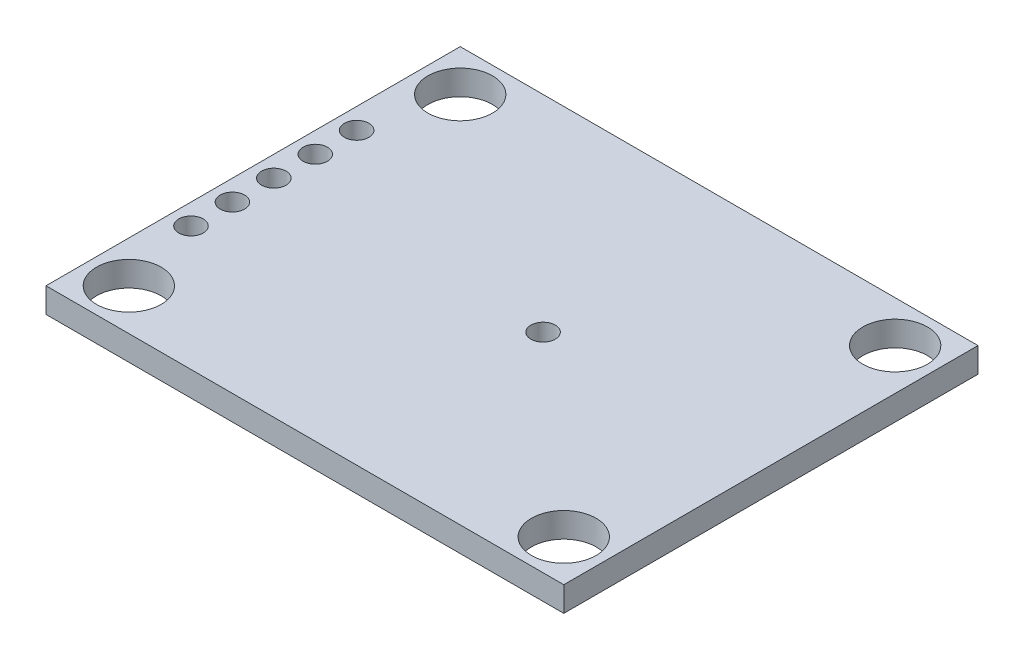
ISO-10303-21;
HEADER;
FILE_DESCRIPTION(('STEP AP214'),'2;1');
FILE_NAME('part.step','',(''),(''),'','','');
FILE_SCHEMA(('AUTOMOTIVE_DESIGN { 1 0 10303 214 1 1 1 1 }'));
ENDSEC;
DATA;
#1=APPLICATION_CONTEXT('core data for automotive mechanical design processes');
#2=APPLICATION_PROTOCOL_DEFINITION('international standard','automotive_design',2000,#1);
#3=PRODUCT_CONTEXT('',#1,'mechanical');
#4=PRODUCT('Part','Part','',(#3));
#5=PRODUCT_RELATED_PRODUCT_CATEGORY('part','',(#4));
#6=PRODUCT_DEFINITION_FORMATION('','',#4);
#7=PRODUCT_DEFINITION_CONTEXT('part definition',#1,'design');
#8=PRODUCT_DEFINITION('design','',#6,#7);
#9=PRODUCT_DEFINITION_SHAPE('','',#8);
#10=(LENGTH_UNIT() NAMED_UNIT(*) SI_UNIT(.MILLI.,.METRE.));
#11=(NAMED_UNIT(*) PLANE_ANGLE_UNIT() SI_UNIT($,.RADIAN.));
#12=(NAMED_UNIT(*) SI_UNIT($,.STERADIAN.) SOLID_ANGLE_UNIT());
#13=UNCERTAINTY_MEASURE_WITH_UNIT(LENGTH_MEASURE(1.E-05),#10,'distance_accuracy_value','');
#14=(GEOMETRIC_REPRESENTATION_CONTEXT(3) GLOBAL_UNCERTAINTY_ASSIGNED_CONTEXT((#13)) GLOBAL_UNIT_ASSIGNED_CONTEXT((#10,
#11,#12)) REPRESENTATION_CONTEXT('',''));
#15=CARTESIAN_POINT('',(0.,0.,0.));
#16=DIRECTION('',(0.,0.,1.));
#17=DIRECTION('',(1.,0.,0.));
#18=AXIS2_PLACEMENT_3D('',#15,#16,#17);
#19=CARTESIAN_POINT('',(15.875,1.524,12.7));
#20=DIRECTION('',(-1.,0.,0.));
#21=DIRECTION('',(0.,0.,1.));
#22=AXIS2_PLACEMENT_3D('',#19,#20,#21);
#23=PLANE('',#22);
#24=DIRECTION('',(0.,0.,-1.));
#25=VECTOR('',#24,1.);
#26=CARTESIAN_POINT('',(15.875,0.,12.7));
#27=LINE('',#26,#25);
#28=CARTESIAN_POINT('',(15.875,0.,12.7));
#29=VERTEX_POINT('',#28);
#30=CARTESIAN_POINT('',(15.875,0.,-12.7));
#31=VERTEX_POINT('',#30);
#32=EDGE_CURVE('E103',#29,#31,#27,.T.);
#33=ORIENTED_EDGE('',*,*,#32,.T.);
#34=DIRECTION('',(0.,-1.,0.));
#35=VECTOR('',#34,1.);
#36=CARTESIAN_POINT('',(15.875,1.524,-12.7));
#37=LINE('',#36,#35);
#38=CARTESIAN_POINT('',(15.875,1.524,-12.7));
#39=VERTEX_POINT('',#38);
#40=EDGE_CURVE('E94',#39,#31,#37,.T.);
#41=ORIENTED_EDGE('',*,*,#40,.F.);
#42=DIRECTION('',(0.,0.,-1.));
#43=VECTOR('',#42,1.);
#44=CARTESIAN_POINT('',(15.875,1.524,12.7));
#45=LINE('',#44,#43);
#46=CARTESIAN_POINT('',(15.875,1.524,12.7));
#47=VERTEX_POINT('',#46);
#48=EDGE_CURVE('E88',#47,#39,#45,.T.);
#49=ORIENTED_EDGE('',*,*,#48,.F.);
#50=DIRECTION('',(0.,-1.,0.));
#51=VECTOR('',#50,1.);
#52=CARTESIAN_POINT('',(15.875,1.524,12.7));
#53=LINE('',#52,#51);
#54=EDGE_CURVE('E99',#47,#29,#53,.T.);
#55=ORIENTED_EDGE('',*,*,#54,.T.);
#56=EDGE_LOOP('',(#33,#41,#49,#55));
#57=FACE_BOUND('',#56,.T.);
#58=ADVANCED_FACE('F34',(#57),#23,.F.);
#59=CARTESIAN_POINT('',(-15.875,1.524,-12.7));
#60=DIRECTION('',(0.,0.,1.));
#61=DIRECTION('',(1.,0.,0.));
#62=AXIS2_PLACEMENT_3D('',#59,#60,#61);
#63=PLANE('',#62);
#64=DIRECTION('',(-1.,0.,0.));
#65=VECTOR('',#64,1.);
#66=CARTESIAN_POINT('',(-15.875,0.,-12.7));
#67=LINE('',#66,#65);
#68=CARTESIAN_POINT('',(-15.875,0.,-12.7));
#69=VERTEX_POINT('',#68);
#70=EDGE_CURVE('E93',#31,#69,#67,.T.);
#71=ORIENTED_EDGE('',*,*,#70,.T.);
#72=DIRECTION('',(0.,-1.,0.));
#73=VECTOR('',#72,1.);
#74=CARTESIAN_POINT('',(-15.875,1.524,-12.7));
#75=LINE('',#74,#73);
#76=CARTESIAN_POINT('',(-15.875,1.524,-12.7));
#77=VERTEX_POINT('',#76);
#78=EDGE_CURVE('E91',#77,#69,#75,.T.);
#79=ORIENTED_EDGE('',*,*,#78,.F.);
#80=DIRECTION('',(-1.,0.,0.));
#81=VECTOR('',#80,1.);
#82=CARTESIAN_POINT('',(-15.875,1.524,-12.7));
#83=LINE('',#82,#81);
#84=EDGE_CURVE('E82',#39,#77,#83,.T.);
#85=ORIENTED_EDGE('',*,*,#84,.F.);
#86=ORIENTED_EDGE('',*,*,#40,.T.);
#87=EDGE_LOOP('',(#71,#79,#85,#86));
#88=FACE_BOUND('',#87,.T.);
#89=ADVANCED_FACE('F92',(#88),#63,.F.);
#90=CARTESIAN_POINT('',(-15.875,1.524,12.7));
#91=DIRECTION('',(1.,0.,0.));
#92=DIRECTION('',(0.,0.,-1.));
#93=AXIS2_PLACEMENT_3D('',#90,#91,#92);
#94=PLANE('',#93);
#95=DIRECTION('',(0.,0.,1.));
#96=VECTOR('',#95,1.);
#97=CARTESIAN_POINT('',(-15.875,0.,12.7));
#98=LINE('',#97,#96);
#99=CARTESIAN_POINT('',(-15.875,0.,12.7));
#100=VERTEX_POINT('',#99);
#101=EDGE_CURVE('E68',#69,#100,#98,.T.);
#102=ORIENTED_EDGE('',*,*,#101,.T.);
#103=DIRECTION('',(0.,-1.,0.));
#104=VECTOR('',#103,1.);
#105=CARTESIAN_POINT('',(-15.875,1.524,12.7));
#106=LINE('',#105,#104);
#107=CARTESIAN_POINT('',(-15.875,1.524,12.7));
#108=VERTEX_POINT('',#107);
#109=EDGE_CURVE('E95',#108,#100,#106,.T.);
#110=ORIENTED_EDGE('',*,*,#109,.F.);
#111=DIRECTION('',(0.,0.,1.));
#112=VECTOR('',#111,1.);
#113=CARTESIAN_POINT('',(-15.875,1.524,12.7));
#114=LINE('',#113,#112);
#115=EDGE_CURVE('E86',#77,#108,#114,.T.);
#116=ORIENTED_EDGE('',*,*,#115,.F.);
#117=ORIENTED_EDGE('',*,*,#78,.T.);
#118=EDGE_LOOP('',(#102,#110,#116,#117));
#119=FACE_BOUND('',#118,.T.);
#120=ADVANCED_FACE('F97',(#119),#94,.F.);
#121=CARTESIAN_POINT('',(-15.875,1.524,12.7));
#122=DIRECTION('',(0.,0.,-1.));
#123=DIRECTION('',(-1.,0.,0.));
#124=AXIS2_PLACEMENT_3D('',#121,#122,#123);
#125=PLANE('',#124);
#126=DIRECTION('',(1.,0.,0.));
#127=VECTOR('',#126,1.);
#128=CARTESIAN_POINT('',(-15.875,0.,12.7));
#129=LINE('',#128,#127);
#130=EDGE_CURVE('E74',#100,#29,#129,.T.);
#131=ORIENTED_EDGE('',*,*,#130,.T.);
#132=ORIENTED_EDGE('',*,*,#54,.F.);
#133=DIRECTION('',(1.,0.,0.));
#134=VECTOR('',#133,1.);
#135=CARTESIAN_POINT('',(-15.875,1.524,12.7));
#136=LINE('',#135,#134);
#137=EDGE_CURVE('E51',#108,#47,#136,.T.);
#138=ORIENTED_EDGE('',*,*,#137,.F.);
#139=ORIENTED_EDGE('',*,*,#109,.T.);
#140=EDGE_LOOP('',(#131,#132,#138,#139));
#141=FACE_BOUND('',#140,.T.);
#142=ADVANCED_FACE('F136',(#141),#125,.F.);
#143=CARTESIAN_POINT('',(15.875,1.524,-12.7));
#144=DIRECTION('',(0.,-1.,0.));
#145=DIRECTION('',(0.,0.,-1.));
#146=AXIS2_PLACEMENT_3D('',#143,#144,#145);
#147=PLANE('',#146);
#148=CARTESIAN_POINT('',(1.8288,1.524,-0.0762));
#149=DIRECTION('',(0.,1.,0.));
#150=DIRECTION('',(0.,0.,1.));
#151=AXIS2_PLACEMENT_3D('',#148,#149,#150);
#152=CIRCLE('',#151,0.7493);
#153=CARTESIAN_POINT('',(1.8288,1.524,0.6731));
#154=VERTEX_POINT('',#153);
#155=EDGE_CURVE('E284',#154,#154,#152,.T.);
#156=ORIENTED_EDGE('',*,*,#155,.F.);
#157=EDGE_LOOP('',(#156));
#158=FACE_BOUND('',#157,.T.);
#159=CARTESIAN_POINT('',(-14.605,1.524,-2.54));
#160=DIRECTION('',(0.,1.,0.));
#161=DIRECTION('',(0.,0.,1.));
#162=AXIS2_PLACEMENT_3D('',#159,#160,#161);
#163=CIRCLE('',#162,0.75);
#164=CARTESIAN_POINT('',(-14.605,1.524,-1.79));
#165=VERTEX_POINT('',#164);
#166=EDGE_CURVE('E278',#165,#165,#163,.T.);
#167=ORIENTED_EDGE('',*,*,#166,.F.);
#168=EDGE_LOOP('',(#167));
#169=FACE_BOUND('',#168,.T.);
#170=CARTESIAN_POINT('',(-14.605,1.524,-5.08));
#171=DIRECTION('',(0.,1.,0.));
#172=DIRECTION('',(0.,0.,1.));
#173=AXIS2_PLACEMENT_3D('',#170,#171,#172);
#174=CIRCLE('',#173,0.75);
#175=CARTESIAN_POINT('',(-14.605,1.524,-4.33));
#176=VERTEX_POINT('',#175);
#177=EDGE_CURVE('E282',#176,#176,#174,.T.);
#178=ORIENTED_EDGE('',*,*,#177,.F.);
#179=EDGE_LOOP('',(#178));
#180=FACE_BOUND('',#179,.T.);
#181=CARTESIAN_POINT('',(13.335,1.524,10.16));
#182=DIRECTION('',(0.,1.,0.));
#183=DIRECTION('',(0.,0.,1.));
#184=AXIS2_PLACEMENT_3D('',#181,#182,#183);
#185=CIRCLE('',#184,1.9812);
#186=CARTESIAN_POINT('',(13.335,1.524,12.1412));
#187=VERTEX_POINT('',#186);
#188=EDGE_CURVE('E291',#187,#187,#185,.T.);
#189=ORIENTED_EDGE('',*,*,#188,.F.);
#190=EDGE_LOOP('',(#189));
#191=FACE_BOUND('',#190,.T.);
#192=CARTESIAN_POINT('',(-13.335,1.524,10.16));
#193=DIRECTION('',(0.,1.,0.));
#194=DIRECTION('',(0.,0.,-1.));
#195=AXIS2_PLACEMENT_3D('',#192,#193,#194);
#196=CIRCLE('',#195,1.9812);
#197=CARTESIAN_POINT('',(-13.335,1.524,8.1788));
#198=VERTEX_POINT('',#197);
#199=EDGE_CURVE('E297',#198,#198,#196,.T.);
#200=ORIENTED_EDGE('',*,*,#199,.F.);
#201=EDGE_LOOP('',(#200));
#202=FACE_BOUND('',#201,.T.);
#203=CARTESIAN_POINT('',(13.335,1.524,-10.16));
#204=DIRECTION('',(0.,1.,0.));
#205=DIRECTION('',(0.,0.,-1.));
#206=AXIS2_PLACEMENT_3D('',#203,#204,#205);
#207=CIRCLE('',#206,1.9812);
#208=CARTESIAN_POINT('',(13.335,1.524,-12.1412));
#209=VERTEX_POINT('',#208);
#210=EDGE_CURVE('E303',#209,#209,#207,.T.);
#211=ORIENTED_EDGE('',*,*,#210,.F.);
#212=EDGE_LOOP('',(#211));
#213=FACE_BOUND('',#212,.T.);
#214=CARTESIAN_POINT('',(-13.335,1.524,-10.16));
#215=DIRECTION('',(0.,1.,0.));
#216=DIRECTION('',(0.,0.,1.));
#217=AXIS2_PLACEMENT_3D('',#214,#215,#216);
#218=CIRCLE('',#217,1.9812);
#219=CARTESIAN_POINT('',(-13.335,1.524,-8.1788));
#220=VERTEX_POINT('',#219);
#221=EDGE_CURVE('E106',#220,#220,#218,.T.);
#222=ORIENTED_EDGE('',*,*,#221,.F.);
#223=EDGE_LOOP('',(#222));
#224=FACE_BOUND('',#223,.T.);
#225=ORIENTED_EDGE('',*,*,#48,.T.);
#226=ORIENTED_EDGE('',*,*,#84,.T.);
#227=ORIENTED_EDGE('',*,*,#115,.T.);
#228=ORIENTED_EDGE('',*,*,#137,.T.);
#229=EDGE_LOOP('',(#225,#226,#227,#228));
#230=FACE_BOUND('',#229,.T.);
#231=CARTESIAN_POINT('',(-14.605,1.524,0.));
#232=DIRECTION('',(0.,1.,0.));
#233=DIRECTION('',(0.,0.,1.));
#234=AXIS2_PLACEMENT_3D('',#231,#232,#233);
#235=CIRCLE('',#234,0.75);
#236=CARTESIAN_POINT('',(-14.605,1.524,0.75));
#237=VERTEX_POINT('',#236);
#238=EDGE_CURVE('E116',#237,#237,#235,.T.);
#239=ORIENTED_EDGE('',*,*,#238,.F.);
#240=EDGE_LOOP('',(#239));
#241=FACE_BOUND('',#240,.T.);
#242=CARTESIAN_POINT('',(-14.605,1.524,2.54));
#243=DIRECTION('',(0.,1.,0.));
#244=DIRECTION('',(0.,0.,1.));
#245=AXIS2_PLACEMENT_3D('',#242,#243,#244);
#246=CIRCLE('',#245,0.75);
#247=CARTESIAN_POINT('',(-14.605,1.524,3.29));
#248=VERTEX_POINT('',#247);
#249=EDGE_CURVE('E122',#248,#248,#246,.T.);
#250=ORIENTED_EDGE('',*,*,#249,.F.);
#251=EDGE_LOOP('',(#250));
#252=FACE_BOUND('',#251,.T.);
#253=CARTESIAN_POINT('',(-14.605,1.524,5.08));
#254=DIRECTION('',(0.,1.,0.));
#255=DIRECTION('',(0.,0.,1.));
#256=AXIS2_PLACEMENT_3D('',#253,#254,#255);
#257=CIRCLE('',#256,0.75);
#258=CARTESIAN_POINT('',(-14.605,1.524,5.83));
#259=VERTEX_POINT('',#258);
#260=EDGE_CURVE('E11',#259,#259,#257,.T.);
#261=ORIENTED_EDGE('',*,*,#260,.F.);
#262=EDGE_LOOP('',(#261));
#263=FACE_BOUND('',#262,.T.);
#264=ADVANCED_FACE('F83',(#158,#169,#180,#191,#202,#213,#224,#230,#241,#252,#263),#147,.F.);
#265=CARTESIAN_POINT('',(15.875,0.,-12.7));
#266=DIRECTION('',(0.,-1.,0.));
#267=DIRECTION('',(0.,0.,-1.));
#268=AXIS2_PLACEMENT_3D('',#265,#266,#267);
#269=PLANE('',#268);
#270=CARTESIAN_POINT('',(1.8288,0.,-0.0762));
#271=DIRECTION('',(0.,-1.,0.));
#272=DIRECTION('',(0.,0.,-1.));
#273=AXIS2_PLACEMENT_3D('',#270,#271,#272);
#274=CIRCLE('',#273,0.7493);
#275=CARTESIAN_POINT('',(1.8288,0.,-0.8255));
#276=VERTEX_POINT('',#275);
#277=EDGE_CURVE('E341',#276,#276,#274,.F.);
#278=ORIENTED_EDGE('',*,*,#277,.T.);
#279=EDGE_LOOP('',(#278));
#280=FACE_BOUND('',#279,.T.);
#281=CARTESIAN_POINT('',(-14.605,0.,-2.54));
#282=DIRECTION('',(0.,-1.,0.));
#283=DIRECTION('',(0.,0.,-1.));
#284=AXIS2_PLACEMENT_3D('',#281,#282,#283);
#285=CIRCLE('',#284,0.75);
#286=CARTESIAN_POINT('',(-14.605,0.,-3.29));
#287=VERTEX_POINT('',#286);
#288=EDGE_CURVE('E275',#287,#287,#285,.F.);
#289=ORIENTED_EDGE('',*,*,#288,.T.);
#290=EDGE_LOOP('',(#289));
#291=FACE_BOUND('',#290,.T.);
#292=CARTESIAN_POINT('',(-14.605,0.,-5.08));
#293=DIRECTION('',(0.,-1.,0.));
#294=DIRECTION('',(0.,0.,-1.));
#295=AXIS2_PLACEMENT_3D('',#292,#293,#294);
#296=CIRCLE('',#295,0.75);
#297=CARTESIAN_POINT('',(-14.605,0.,-5.83));
#298=VERTEX_POINT('',#297);
#299=EDGE_CURVE('E279',#298,#298,#296,.F.);
#300=ORIENTED_EDGE('',*,*,#299,.T.);
#301=EDGE_LOOP('',(#300));
#302=FACE_BOUND('',#301,.T.);
#303=CARTESIAN_POINT('',(13.335,0.,10.16));
#304=DIRECTION('',(0.,-1.,0.));
#305=DIRECTION('',(0.,0.,-1.));
#306=AXIS2_PLACEMENT_3D('',#303,#304,#305);
#307=CIRCLE('',#306,1.9812);
#308=CARTESIAN_POINT('',(13.335,0.,8.1788));
#309=VERTEX_POINT('',#308);
#310=EDGE_CURVE('E289',#309,#309,#307,.F.);
#311=ORIENTED_EDGE('',*,*,#310,.T.);
#312=EDGE_LOOP('',(#311));
#313=FACE_BOUND('',#312,.T.);
#314=CARTESIAN_POINT('',(-13.335,0.,10.16));
#315=DIRECTION('',(0.,-1.,0.));
#316=DIRECTION('',(0.,0.,-1.));
#317=AXIS2_PLACEMENT_3D('',#314,#315,#316);
#318=CIRCLE('',#317,1.9812);
#319=CARTESIAN_POINT('',(-13.335,0.,8.1788));
#320=VERTEX_POINT('',#319);
#321=EDGE_CURVE('E294',#320,#320,#318,.F.);
#322=ORIENTED_EDGE('',*,*,#321,.T.);
#323=EDGE_LOOP('',(#322));
#324=FACE_BOUND('',#323,.T.);
#325=CARTESIAN_POINT('',(13.335,0.,-10.16));
#326=DIRECTION('',(0.,-1.,0.));
#327=DIRECTION('',(0.,0.,-1.));
#328=AXIS2_PLACEMENT_3D('',#325,#326,#327);
#329=CIRCLE('',#328,1.9812);
#330=CARTESIAN_POINT('',(13.335,0.,-12.1412));
#331=VERTEX_POINT('',#330);
#332=EDGE_CURVE('E300',#331,#331,#329,.F.);
#333=ORIENTED_EDGE('',*,*,#332,.T.);
#334=EDGE_LOOP('',(#333));
#335=FACE_BOUND('',#334,.T.);
#336=CARTESIAN_POINT('',(-13.335,0.,-10.16));
#337=DIRECTION('',(0.,-1.,0.));
#338=DIRECTION('',(0.,0.,-1.));
#339=AXIS2_PLACEMENT_3D('',#336,#337,#338);
#340=CIRCLE('',#339,1.9812);
#341=CARTESIAN_POINT('',(-13.335,0.,-12.1412));
#342=VERTEX_POINT('',#341);
#343=EDGE_CURVE('E306',#342,#342,#340,.F.);
#344=ORIENTED_EDGE('',*,*,#343,.T.);
#345=EDGE_LOOP('',(#344));
#346=FACE_BOUND('',#345,.T.);
#347=ORIENTED_EDGE('',*,*,#32,.F.);
#348=ORIENTED_EDGE('',*,*,#130,.F.);
#349=ORIENTED_EDGE('',*,*,#101,.F.);
#350=ORIENTED_EDGE('',*,*,#70,.F.);
#351=EDGE_LOOP('',(#347,#348,#349,#350));
#352=FACE_BOUND('',#351,.T.);
#353=CARTESIAN_POINT('',(-14.605,0.,0.));
#354=DIRECTION('',(0.,-1.,0.));
#355=DIRECTION('',(0.,0.,-1.));
#356=AXIS2_PLACEMENT_3D('',#353,#354,#355);
#357=CIRCLE('',#356,0.75);
#358=CARTESIAN_POINT('',(-14.605,0.,-0.75));
#359=VERTEX_POINT('',#358);
#360=EDGE_CURVE('E113',#359,#359,#357,.F.);
#361=ORIENTED_EDGE('',*,*,#360,.T.);
#362=EDGE_LOOP('',(#361));
#363=FACE_BOUND('',#362,.T.);
#364=CARTESIAN_POINT('',(-14.605,0.,2.54));
#365=DIRECTION('',(0.,-1.,0.));
#366=DIRECTION('',(0.,0.,-1.));
#367=AXIS2_PLACEMENT_3D('',#364,#365,#366);
#368=CIRCLE('',#367,0.75);
#369=CARTESIAN_POINT('',(-14.605,0.,1.79));
#370=VERTEX_POINT('',#369);
#371=EDGE_CURVE('E119',#370,#370,#368,.F.);
#372=ORIENTED_EDGE('',*,*,#371,.T.);
#373=EDGE_LOOP('',(#372));
#374=FACE_BOUND('',#373,.T.);
#375=CARTESIAN_POINT('',(-14.605,0.,5.08));
#376=DIRECTION('',(0.,-1.,0.));
#377=DIRECTION('',(0.,0.,-1.));
#378=AXIS2_PLACEMENT_3D('',#375,#376,#377);
#379=CIRCLE('',#378,0.75);
#380=CARTESIAN_POINT('',(-14.605,0.,4.33));
#381=VERTEX_POINT('',#380);
#382=EDGE_CURVE('E43',#381,#381,#379,.F.);
#383=ORIENTED_EDGE('',*,*,#382,.T.);
#384=EDGE_LOOP('',(#383));
#385=FACE_BOUND('',#384,.T.);
#386=ADVANCED_FACE('F127',(#280,#291,#302,#313,#324,#335,#346,#352,#363,#374,#385),#269,.T.);
#387=CARTESIAN_POINT('',(-13.335,-0.000999999999999916,-10.16));
#388=DIRECTION('',(0.,1.,0.));
#389=DIRECTION('',(0.,0.,1.));
#390=AXIS2_PLACEMENT_3D('',#387,#388,#389);
#391=CYLINDRICAL_SURFACE('',#390,1.9812);
#392=ORIENTED_EDGE('',*,*,#343,.F.);
#393=EDGE_LOOP('',(#392));
#394=FACE_BOUND('',#393,.T.);
#395=ORIENTED_EDGE('',*,*,#221,.T.);
#396=EDGE_LOOP('',(#395));
#397=FACE_BOUND('',#396,.T.);
#398=ADVANCED_FACE('F143',(#394,#397),#391,.F.);
#399=CARTESIAN_POINT('',(13.335,-0.000999999999999916,-10.16));
#400=DIRECTION('',(0.,1.,0.));
#401=DIRECTION('',(0.,0.,1.));
#402=AXIS2_PLACEMENT_3D('',#399,#400,#401);
#403=CYLINDRICAL_SURFACE('',#402,1.9812);
#404=ORIENTED_EDGE('',*,*,#332,.F.);
#405=EDGE_LOOP('',(#404));
#406=FACE_BOUND('',#405,.T.);
#407=ORIENTED_EDGE('',*,*,#210,.T.);
#408=EDGE_LOOP('',(#407));
#409=FACE_BOUND('',#408,.T.);
#410=ADVANCED_FACE('F212',(#406,#409),#403,.F.);
#411=CARTESIAN_POINT('',(-13.335,-0.000999999999999916,10.16));
#412=DIRECTION('',(0.,1.,0.));
#413=DIRECTION('',(0.,0.,1.));
#414=AXIS2_PLACEMENT_3D('',#411,#412,#413);
#415=CYLINDRICAL_SURFACE('',#414,1.9812);
#416=ORIENTED_EDGE('',*,*,#321,.F.);
#417=EDGE_LOOP('',(#416));
#418=FACE_BOUND('',#417,.T.);
#419=ORIENTED_EDGE('',*,*,#199,.T.);
#420=EDGE_LOOP('',(#419));
#421=FACE_BOUND('',#420,.T.);
#422=ADVANCED_FACE('F219',(#418,#421),#415,.F.);
#423=CARTESIAN_POINT('',(13.335,-0.000999999999999916,10.16));
#424=DIRECTION('',(0.,1.,0.));
#425=DIRECTION('',(0.,0.,1.));
#426=AXIS2_PLACEMENT_3D('',#423,#424,#425);
#427=CYLINDRICAL_SURFACE('',#426,1.9812);
#428=ORIENTED_EDGE('',*,*,#310,.F.);
#429=EDGE_LOOP('',(#428));
#430=FACE_BOUND('',#429,.T.);
#431=ORIENTED_EDGE('',*,*,#188,.T.);
#432=EDGE_LOOP('',(#431));
#433=FACE_BOUND('',#432,.T.);
#434=ADVANCED_FACE('F227',(#430,#433),#427,.F.);
#435=CARTESIAN_POINT('',(-14.605,-0.000999999999999916,-5.08));
#436=DIRECTION('',(0.,1.,0.));
#437=DIRECTION('',(0.,0.,1.));
#438=AXIS2_PLACEMENT_3D('',#435,#436,#437);
#439=CYLINDRICAL_SURFACE('',#438,0.75);
#440=ORIENTED_EDGE('',*,*,#299,.F.);
#441=EDGE_LOOP('',(#440));
#442=FACE_BOUND('',#441,.T.);
#443=ORIENTED_EDGE('',*,*,#177,.T.);
#444=EDGE_LOOP('',(#443));
#445=FACE_BOUND('',#444,.T.);
#446=ADVANCED_FACE('F235',(#442,#445),#439,.F.);
#447=CARTESIAN_POINT('',(-14.605,-0.000999999999999916,-2.54));
#448=DIRECTION('',(0.,1.,0.));
#449=DIRECTION('',(0.,0.,1.));
#450=AXIS2_PLACEMENT_3D('',#447,#448,#449);
#451=CYLINDRICAL_SURFACE('',#450,0.75);
#452=ORIENTED_EDGE('',*,*,#288,.F.);
#453=EDGE_LOOP('',(#452));
#454=FACE_BOUND('',#453,.T.);
#455=ORIENTED_EDGE('',*,*,#166,.T.);
#456=EDGE_LOOP('',(#455));
#457=FACE_BOUND('',#456,.T.);
#458=ADVANCED_FACE('F161',(#454,#457),#451,.F.);
#459=CARTESIAN_POINT('',(-14.605,-0.000999999999999916,0.));
#460=DIRECTION('',(0.,1.,0.));
#461=DIRECTION('',(0.,0.,1.));
#462=AXIS2_PLACEMENT_3D('',#459,#460,#461);
#463=CYLINDRICAL_SURFACE('',#462,0.75);
#464=ORIENTED_EDGE('',*,*,#360,.F.);
#465=EDGE_LOOP('',(#464));
#466=FACE_BOUND('',#465,.T.);
#467=ORIENTED_EDGE('',*,*,#238,.T.);
#468=EDGE_LOOP('',(#467));
#469=FACE_BOUND('',#468,.T.);
#470=ADVANCED_FACE('F159',(#466,#469),#463,.F.);
#471=CARTESIAN_POINT('',(-14.605,-0.000999999999999916,2.54));
#472=DIRECTION('',(0.,1.,0.));
#473=DIRECTION('',(0.,0.,1.));
#474=AXIS2_PLACEMENT_3D('',#471,#472,#473);
#475=CYLINDRICAL_SURFACE('',#474,0.75);
#476=ORIENTED_EDGE('',*,*,#371,.F.);
#477=EDGE_LOOP('',(#476));
#478=FACE_BOUND('',#477,.T.);
#479=ORIENTED_EDGE('',*,*,#249,.T.);
#480=EDGE_LOOP('',(#479));
#481=FACE_BOUND('',#480,.T.);
#482=ADVANCED_FACE('F132',(#478,#481),#475,.F.);
#483=CARTESIAN_POINT('',(-14.605,-0.000999999999999916,5.08));
#484=DIRECTION('',(0.,1.,0.));
#485=DIRECTION('',(0.,0.,1.));
#486=AXIS2_PLACEMENT_3D('',#483,#484,#485);
#487=CYLINDRICAL_SURFACE('',#486,0.75);
#488=ORIENTED_EDGE('',*,*,#382,.F.);
#489=EDGE_LOOP('',(#488));
#490=FACE_BOUND('',#489,.T.);
#491=ORIENTED_EDGE('',*,*,#260,.T.);
#492=EDGE_LOOP('',(#491));
#493=FACE_BOUND('',#492,.T.);
#494=ADVANCED_FACE('F36',(#490,#493),#487,.F.);
#495=CARTESIAN_POINT('',(1.8288,-0.000999999999999916,-0.0762));
#496=DIRECTION('',(0.,1.,0.));
#497=DIRECTION('',(0.,0.,1.));
#498=AXIS2_PLACEMENT_3D('',#495,#496,#497);
#499=CYLINDRICAL_SURFACE('',#498,0.7493);
#500=ORIENTED_EDGE('',*,*,#277,.F.);
#501=EDGE_LOOP('',(#500));
#502=FACE_BOUND('',#501,.T.);
#503=ORIENTED_EDGE('',*,*,#155,.T.);
#504=EDGE_LOOP('',(#503));
#505=FACE_BOUND('',#504,.T.);
#506=ADVANCED_FACE('F131',(#502,#505),#499,.F.);
#507=CLOSED_SHELL('',(#58,#89,#120,#142,#264,#386,#398,#410,#422,#434,#446,#458,#470,#482,#494,#506));
#508=MANIFOLD_SOLID_BREP('B2',#507);
#509=ADVANCED_BREP_SHAPE_REPRESENTATION('',(#18,#508),#14);
#510=SHAPE_DEFINITION_REPRESENTATION(#9,#509);
ENDSEC;
END-ISO-10303-21;
